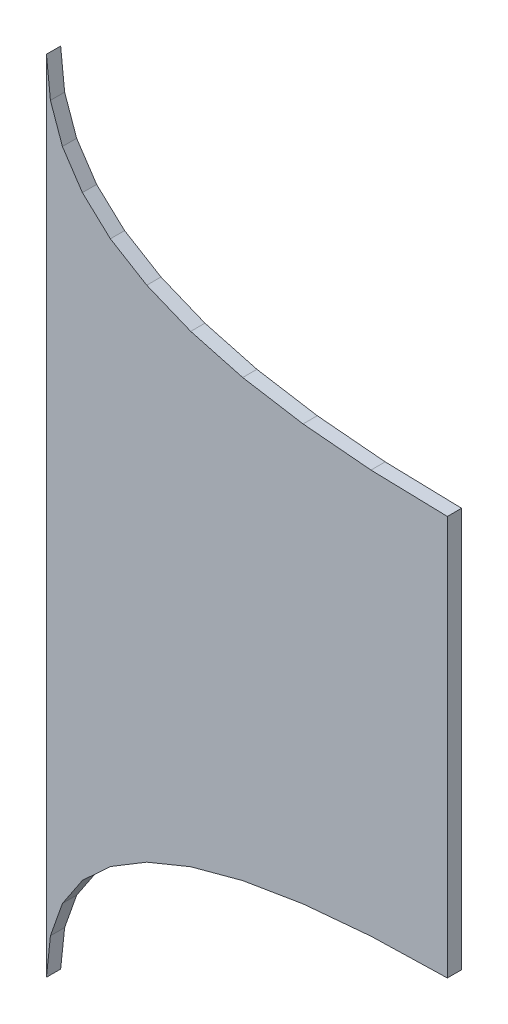
ISO-10303-21;
HEADER;
FILE_DESCRIPTION(('STEP AP214'),'2;1');
FILE_NAME('part.step','',(''),(''),'','','');
FILE_SCHEMA(('AUTOMOTIVE_DESIGN { 1 0 10303 214 1 1 1 1 }'));
ENDSEC;
DATA;
#1=APPLICATION_CONTEXT('core data for automotive mechanical design processes');
#2=APPLICATION_PROTOCOL_DEFINITION('international standard','automotive_design',2000,#1);
#3=PRODUCT_CONTEXT('',#1,'mechanical');
#4=PRODUCT('Part','Part','',(#3));
#5=PRODUCT_RELATED_PRODUCT_CATEGORY('part','',(#4));
#6=PRODUCT_DEFINITION_FORMATION('','',#4);
#7=PRODUCT_DEFINITION_CONTEXT('part definition',#1,'design');
#8=PRODUCT_DEFINITION('design','',#6,#7);
#9=PRODUCT_DEFINITION_SHAPE('','',#8);
#10=(LENGTH_UNIT() NAMED_UNIT(*) SI_UNIT(.MILLI.,.METRE.));
#11=(NAMED_UNIT(*) PLANE_ANGLE_UNIT() SI_UNIT($,.RADIAN.));
#12=(NAMED_UNIT(*) SI_UNIT($,.STERADIAN.) SOLID_ANGLE_UNIT());
#13=UNCERTAINTY_MEASURE_WITH_UNIT(LENGTH_MEASURE(1.E-05),#10,'distance_accuracy_value','');
#14=(GEOMETRIC_REPRESENTATION_CONTEXT(3) GLOBAL_UNCERTAINTY_ASSIGNED_CONTEXT((#13)) GLOBAL_UNIT_ASSIGNED_CONTEXT((#10,
#11,#12)) REPRESENTATION_CONTEXT('',''));
#15=CARTESIAN_POINT('',(0.,0.,0.));
#16=DIRECTION('',(0.,0.,1.));
#17=DIRECTION('',(1.,0.,0.));
#18=AXIS2_PLACEMENT_3D('',#15,#16,#17);
#19=CARTESIAN_POINT('',(80.3170013427734,43.,0.));
#20=DIRECTION('',(-0.0261743727073758,-0.99965739241671,0.));
#21=DIRECTION('',(-0.99965739241671,0.0261743727073758,0.));
#22=AXIS2_PLACEMENT_3D('',#19,#20,#21);
#23=PLANE('',#22);
#24=DIRECTION('',(-0.99965739241671,0.0261743727073758,0.));
#25=VECTOR('',#24,1.);
#26=CARTESIAN_POINT('',(80.3170013427734,43.,0.03556));
#27=LINE('',#26,#25);
#28=CARTESIAN_POINT('',(80.3170013427734,43.,0.03556));
#29=VERTEX_POINT('',#28);
#30=CARTESIAN_POINT('',(80.1259994506836,43.0050010681152,0.03556));
#31=VERTEX_POINT('',#30);
#32=EDGE_CURVE('E11',#29,#31,#27,.T.);
#33=ORIENTED_EDGE('',*,*,#32,.F.);
#34=DIRECTION('',(0.,0.,1.));
#35=VECTOR('',#34,1.);
#36=CARTESIAN_POINT('',(80.3170013427734,43.,0.));
#37=LINE('',#36,#35);
#38=CARTESIAN_POINT('',(80.3170013427734,43.,0.));
#39=VERTEX_POINT('',#38);
#40=EDGE_CURVE('E24',#39,#29,#37,.T.);
#41=ORIENTED_EDGE('',*,*,#40,.F.);
#42=DIRECTION('',(-0.99965739241671,0.0261743727073758,0.));
#43=VECTOR('',#42,1.);
#44=CARTESIAN_POINT('',(80.3170013427734,43.,0.));
#45=LINE('',#44,#43);
#46=CARTESIAN_POINT('',(80.1259994506836,43.0050010681152,0.));
#47=VERTEX_POINT('',#46);
#48=EDGE_CURVE('E184',#39,#47,#45,.T.);
#49=ORIENTED_EDGE('',*,*,#48,.T.);
#50=DIRECTION('',(0.,0.,1.));
#51=VECTOR('',#50,1.);
#52=CARTESIAN_POINT('',(80.1259994506836,43.0050010681152,0.));
#53=LINE('',#52,#51);
#54=EDGE_CURVE('E37',#47,#31,#53,.T.);
#55=ORIENTED_EDGE('',*,*,#54,.T.);
#56=EDGE_LOOP('',(#33,#41,#49,#55));
#57=FACE_BOUND('',#56,.T.);
#58=ADVANCED_FACE('F17',(#57),#23,.F.);
#59=CARTESIAN_POINT('',(80.1259994506836,43.0050010681152,0.));
#60=DIRECTION('',(-0.0878912008707353,-0.996130080265374,0.));
#61=DIRECTION('',(-0.996130080265374,0.0878912008707353,0.));
#62=AXIS2_PLACEMENT_3D('',#59,#60,#61);
#63=PLANE('',#62);
#64=DIRECTION('',(-0.996130080265374,0.0878912008707353,0.));
#65=VECTOR('',#64,1.);
#66=CARTESIAN_POINT('',(80.1259994506836,43.0050010681152,0.03556));
#67=LINE('',#66,#65);
#68=CARTESIAN_POINT('',(79.9560012817383,43.0200004577637,0.03556));
#69=VERTEX_POINT('',#68);
#70=EDGE_CURVE('E336',#31,#69,#67,.T.);
#71=ORIENTED_EDGE('',*,*,#70,.F.);
#72=ORIENTED_EDGE('',*,*,#54,.F.);
#73=DIRECTION('',(-0.996130080265374,0.0878912008707353,0.));
#74=VECTOR('',#73,1.);
#75=CARTESIAN_POINT('',(80.1259994506836,43.0050010681152,0.));
#76=LINE('',#75,#74);
#77=CARTESIAN_POINT('',(79.9560012817383,43.0200004577637,0.));
#78=VERTEX_POINT('',#77);
#79=EDGE_CURVE('E333',#47,#78,#76,.T.);
#80=ORIENTED_EDGE('',*,*,#79,.T.);
#81=DIRECTION('',(0.,0.,1.));
#82=VECTOR('',#81,1.);
#83=CARTESIAN_POINT('',(79.9560012817383,43.0200004577637,0.));
#84=LINE('',#83,#82);
#85=EDGE_CURVE('E331',#78,#69,#84,.T.);
#86=ORIENTED_EDGE('',*,*,#85,.T.);
#87=EDGE_LOOP('',(#71,#72,#80,#86));
#88=FACE_BOUND('',#87,.T.);
#89=ADVANCED_FACE('F344',(#88),#63,.F.);
#90=CARTESIAN_POINT('',(79.9560012817383,43.0200004577637,0.));
#91=DIRECTION('',(-0.163323810363842,-0.986572517845615,0.));
#92=DIRECTION('',(-0.986572517845615,0.163323810363842,0.));
#93=AXIS2_PLACEMENT_3D('',#90,#91,#92);
#94=PLANE('',#93);
#95=DIRECTION('',(-0.986572517845615,0.163323810363842,0.));
#96=VECTOR('',#95,1.);
#97=CARTESIAN_POINT('',(79.9560012817383,43.0200004577637,0.03556));
#98=LINE('',#97,#96);
#99=CARTESIAN_POINT('',(79.8050003051758,43.0449981689453,0.03556));
#100=VERTEX_POINT('',#99);
#101=EDGE_CURVE('E328',#69,#100,#98,.T.);
#102=ORIENTED_EDGE('',*,*,#101,.F.);
#103=ORIENTED_EDGE('',*,*,#85,.F.);
#104=DIRECTION('',(-0.986572517845615,0.163323810363842,0.));
#105=VECTOR('',#104,1.);
#106=CARTESIAN_POINT('',(79.9560012817383,43.0200004577637,0.));
#107=LINE('',#106,#105);
#108=CARTESIAN_POINT('',(79.8050003051758,43.0449981689453,0.));
#109=VERTEX_POINT('',#108);
#110=EDGE_CURVE('E325',#78,#109,#107,.T.);
#111=ORIENTED_EDGE('',*,*,#110,.T.);
#112=DIRECTION('',(0.,0.,1.));
#113=VECTOR('',#112,1.);
#114=CARTESIAN_POINT('',(79.8050003051758,43.0449981689453,0.));
#115=LINE('',#114,#113);
#116=EDGE_CURVE('E323',#109,#100,#115,.T.);
#117=ORIENTED_EDGE('',*,*,#116,.T.);
#118=EDGE_LOOP('',(#102,#103,#111,#117));
#119=FACE_BOUND('',#118,.T.);
#120=ADVANCED_FACE('F350',(#119),#94,.F.);
#121=CARTESIAN_POINT('',(79.8050003051758,43.0449981689453,0.));
#122=DIRECTION('',(-0.260003958104314,-0.965607550597079,0.));
#123=DIRECTION('',(-0.965607550597079,0.260003958104314,0.));
#124=AXIS2_PLACEMENT_3D('',#121,#122,#123);
#125=PLANE('',#124);
#126=DIRECTION('',(-0.965607550597079,0.260003958104313,0.));
#127=VECTOR('',#126,1.);
#128=CARTESIAN_POINT('',(79.8050003051758,43.0449981689453,0.03556));
#129=LINE('',#128,#127);
#130=CARTESIAN_POINT('',(79.6750030517578,43.0800018310547,0.03556));
#131=VERTEX_POINT('',#130);
#132=EDGE_CURVE('E320',#100,#131,#129,.T.);
#133=ORIENTED_EDGE('',*,*,#132,.F.);
#134=ORIENTED_EDGE('',*,*,#116,.F.);
#135=DIRECTION('',(-0.965607550597079,0.260003958104313,0.));
#136=VECTOR('',#135,1.);
#137=CARTESIAN_POINT('',(79.8050003051758,43.0449981689453,0.));
#138=LINE('',#137,#136);
#139=CARTESIAN_POINT('',(79.6750030517578,43.0800018310547,0.));
#140=VERTEX_POINT('',#139);
#141=EDGE_CURVE('E317',#109,#140,#138,.T.);
#142=ORIENTED_EDGE('',*,*,#141,.T.);
#143=DIRECTION('',(0.,0.,1.));
#144=VECTOR('',#143,1.);
#145=CARTESIAN_POINT('',(79.6750030517578,43.0800018310547,0.));
#146=LINE('',#145,#144);
#147=EDGE_CURVE('E315',#140,#131,#146,.T.);
#148=ORIENTED_EDGE('',*,*,#147,.T.);
#149=EDGE_LOOP('',(#133,#134,#142,#148));
#150=FACE_BOUND('',#149,.T.);
#151=ADVANCED_FACE('F352',(#150),#125,.F.);
#152=CARTESIAN_POINT('',(79.6750030517578,43.0800018310547,0.));
#153=DIRECTION('',(-0.378617848069705,-0.92555309146643,0.));
#154=DIRECTION('',(-0.92555309146643,0.378617848069705,0.));
#155=AXIS2_PLACEMENT_3D('',#152,#153,#154);
#156=PLANE('',#155);
#157=DIRECTION('',(-0.92555309146643,0.378617848069705,0.));
#158=VECTOR('',#157,1.);
#159=CARTESIAN_POINT('',(79.6750030517578,43.0800018310547,0.03556));
#160=LINE('',#159,#158);
#161=CARTESIAN_POINT('',(79.5650024414062,43.125,0.03556));
#162=VERTEX_POINT('',#161);
#163=EDGE_CURVE('E312',#131,#162,#160,.T.);
#164=ORIENTED_EDGE('',*,*,#163,.F.);
#165=ORIENTED_EDGE('',*,*,#147,.F.);
#166=DIRECTION('',(-0.92555309146643,0.378617848069705,0.));
#167=VECTOR('',#166,1.);
#168=CARTESIAN_POINT('',(79.6750030517578,43.0800018310547,0.));
#169=LINE('',#168,#167);
#170=CARTESIAN_POINT('',(79.5650024414062,43.125,0.));
#171=VERTEX_POINT('',#170);
#172=EDGE_CURVE('E309',#140,#171,#169,.T.);
#173=ORIENTED_EDGE('',*,*,#172,.T.);
#174=DIRECTION('',(0.,0.,1.));
#175=VECTOR('',#174,1.);
#176=CARTESIAN_POINT('',(79.5650024414062,43.125,0.));
#177=LINE('',#176,#175);
#178=EDGE_CURVE('E307',#171,#162,#177,.T.);
#179=ORIENTED_EDGE('',*,*,#178,.T.);
#180=EDGE_LOOP('',(#164,#165,#173,#179));
#181=FACE_BOUND('',#180,.T.);
#182=ADVANCED_FACE('F357',(#181),#156,.F.);
#183=CARTESIAN_POINT('',(79.5650024414062,43.125,0.));
#184=DIRECTION('',(-0.517247042744461,-0.85583613897294,0.));
#185=DIRECTION('',(-0.85583613897294,0.517247042744461,0.));
#186=AXIS2_PLACEMENT_3D('',#183,#184,#185);
#187=PLANE('',#186);
#188=DIRECTION('',(-0.85583613897294,0.517247042744461,0.));
#189=VECTOR('',#188,1.);
#190=CARTESIAN_POINT('',(79.5650024414062,43.125,0.03556));
#191=LINE('',#190,#189);
#192=CARTESIAN_POINT('',(79.4739990234375,43.1800003051758,0.03556));
#193=VERTEX_POINT('',#192);
#194=EDGE_CURVE('E304',#162,#193,#191,.T.);
#195=ORIENTED_EDGE('',*,*,#194,.F.);
#196=ORIENTED_EDGE('',*,*,#178,.F.);
#197=DIRECTION('',(-0.85583613897294,0.517247042744461,0.));
#198=VECTOR('',#197,1.);
#199=CARTESIAN_POINT('',(79.5650024414062,43.125,0.));
#200=LINE('',#199,#198);
#201=CARTESIAN_POINT('',(79.4739990234375,43.1800003051758,0.));
#202=VERTEX_POINT('',#201);
#203=EDGE_CURVE('E301',#171,#202,#200,.T.);
#204=ORIENTED_EDGE('',*,*,#203,.T.);
#205=DIRECTION('',(0.,0.,1.));
#206=VECTOR('',#205,1.);
#207=CARTESIAN_POINT('',(79.4739990234375,43.1800003051758,0.));
#208=LINE('',#207,#206);
#209=EDGE_CURVE('E299',#202,#193,#208,.T.);
#210=ORIENTED_EDGE('',*,*,#209,.T.);
#211=EDGE_LOOP('',(#195,#196,#204,#210));
#212=FACE_BOUND('',#211,.T.);
#213=ADVANCED_FACE('F360',(#212),#187,.F.);
#214=CARTESIAN_POINT('',(79.4739990234375,43.1800003051758,0.));
#215=DIRECTION('',(-0.680444972397261,-0.732799180907901,0.));
#216=DIRECTION('',(-0.732799180907901,0.680444972397261,0.));
#217=AXIS2_PLACEMENT_3D('',#214,#215,#216);
#218=PLANE('',#217);
#219=DIRECTION('',(-0.732799180907901,0.680444972397261,0.));
#220=VECTOR('',#219,1.);
#221=CARTESIAN_POINT('',(79.4739990234375,43.1800003051758,0.03556));
#222=LINE('',#221,#220);
#223=CARTESIAN_POINT('',(79.4039993286133,43.2449989318848,0.03556));
#224=VERTEX_POINT('',#223);
#225=EDGE_CURVE('E296',#193,#224,#222,.T.);
#226=ORIENTED_EDGE('',*,*,#225,.F.);
#227=ORIENTED_EDGE('',*,*,#209,.F.);
#228=DIRECTION('',(-0.732799180907901,0.680444972397261,0.));
#229=VECTOR('',#228,1.);
#230=CARTESIAN_POINT('',(79.4739990234375,43.1800003051758,0.));
#231=LINE('',#230,#229);
#232=CARTESIAN_POINT('',(79.4039993286133,43.2449989318848,0.));
#233=VERTEX_POINT('',#232);
#234=EDGE_CURVE('E293',#202,#233,#231,.T.);
#235=ORIENTED_EDGE('',*,*,#234,.T.);
#236=DIRECTION('',(0.,0.,1.));
#237=VECTOR('',#236,1.);
#238=CARTESIAN_POINT('',(79.4039993286133,43.2449989318848,0.));
#239=LINE('',#238,#237);
#240=EDGE_CURVE('E291',#233,#224,#239,.T.);
#241=ORIENTED_EDGE('',*,*,#240,.T.);
#242=EDGE_LOOP('',(#226,#227,#235,#241));
#243=FACE_BOUND('',#242,.T.);
#244=ADVANCED_FACE('F365',(#243),#218,.F.);
#245=CARTESIAN_POINT('',(79.4039993286133,43.2449989318848,0.));
#246=DIRECTION('',(-0.832037272824398,-0.554719727998688,0.));
#247=DIRECTION('',(-0.554719727998688,0.832037272824398,0.));
#248=AXIS2_PLACEMENT_3D('',#245,#246,#247);
#249=PLANE('',#248);
#250=DIRECTION('',(-0.554719727998688,0.832037272824398,0.));
#251=VECTOR('',#250,1.);
#252=CARTESIAN_POINT('',(79.4039993286133,43.2449989318848,0.03556));
#253=LINE('',#252,#251);
#254=CARTESIAN_POINT('',(79.3539962768555,43.3199996948242,0.03556));
#255=VERTEX_POINT('',#254);
#256=EDGE_CURVE('E288',#224,#255,#253,.T.);
#257=ORIENTED_EDGE('',*,*,#256,.F.);
#258=ORIENTED_EDGE('',*,*,#240,.F.);
#259=DIRECTION('',(-0.554719727998688,0.832037272824398,0.));
#260=VECTOR('',#259,1.);
#261=CARTESIAN_POINT('',(79.4039993286133,43.2449989318848,0.));
#262=LINE('',#261,#260);
#263=CARTESIAN_POINT('',(79.3539962768555,43.3199996948242,0.));
#264=VERTEX_POINT('',#263);
#265=EDGE_CURVE('E285',#233,#264,#262,.T.);
#266=ORIENTED_EDGE('',*,*,#265,.T.);
#267=DIRECTION('',(0.,0.,1.));
#268=VECTOR('',#267,1.);
#269=CARTESIAN_POINT('',(79.3539962768555,43.3199996948242,0.));
#270=LINE('',#269,#268);
#271=EDGE_CURVE('E283',#264,#255,#270,.T.);
#272=ORIENTED_EDGE('',*,*,#271,.T.);
#273=EDGE_LOOP('',(#257,#258,#266,#272));
#274=FACE_BOUND('',#273,.T.);
#275=ADVANCED_FACE('F368',(#274),#249,.F.);
#276=CARTESIAN_POINT('',(79.3539962768555,43.3199996948242,0.));
#277=DIRECTION('',(-0.94299345877424,-0.332811262893844,0.));
#278=DIRECTION('',(-0.332811262893844,0.94299345877424,0.));
#279=AXIS2_PLACEMENT_3D('',#276,#277,#278);
#280=PLANE('',#279);
#281=DIRECTION('',(-0.332811262893844,0.94299345877424,0.));
#282=VECTOR('',#281,1.);
#283=CARTESIAN_POINT('',(79.3539962768555,43.3199996948242,0.03556));
#284=LINE('',#283,#282);
#285=CARTESIAN_POINT('',(79.3239974975586,43.4049987792969,0.03556));
#286=VERTEX_POINT('',#285);
#287=EDGE_CURVE('E280',#255,#286,#284,.T.);
#288=ORIENTED_EDGE('',*,*,#287,.F.);
#289=ORIENTED_EDGE('',*,*,#271,.F.);
#290=DIRECTION('',(-0.332811262893844,0.94299345877424,0.));
#291=VECTOR('',#290,1.);
#292=CARTESIAN_POINT('',(79.3539962768555,43.3199996948242,0.));
#293=LINE('',#292,#291);
#294=CARTESIAN_POINT('',(79.3239974975586,43.4049987792969,0.));
#295=VERTEX_POINT('',#294);
#296=EDGE_CURVE('E277',#264,#295,#293,.T.);
#297=ORIENTED_EDGE('',*,*,#296,.T.);
#298=DIRECTION('',(0.,0.,1.));
#299=VECTOR('',#298,1.);
#300=CARTESIAN_POINT('',(79.3239974975586,43.4049987792969,0.));
#301=LINE('',#300,#299);
#302=EDGE_CURVE('E275',#295,#286,#301,.T.);
#303=ORIENTED_EDGE('',*,*,#302,.T.);
#304=EDGE_LOOP('',(#288,#289,#297,#303));
#305=FACE_BOUND('',#304,.T.);
#306=ADVANCED_FACE('F373',(#305),#280,.F.);
#307=CARTESIAN_POINT('',(79.3239974975586,43.4049987792969,0.));
#308=DIRECTION('',(-0.994511578049105,-0.104626579444613,0.));
#309=DIRECTION('',(-0.104626579444613,0.994511578049105,0.));
#310=AXIS2_PLACEMENT_3D('',#307,#308,#309);
#311=PLANE('',#310);
#312=DIRECTION('',(-0.104626579444613,0.994511578049105,0.));
#313=VECTOR('',#312,1.);
#314=CARTESIAN_POINT('',(79.3239974975586,43.4049987792969,0.03556));
#315=LINE('',#314,#313);
#316=CARTESIAN_POINT('',(79.3140029907227,43.5,0.03556));
#317=VERTEX_POINT('',#316);
#318=EDGE_CURVE('E272',#286,#317,#315,.T.);
#319=ORIENTED_EDGE('',*,*,#318,.F.);
#320=ORIENTED_EDGE('',*,*,#302,.F.);
#321=DIRECTION('',(-0.104626579444613,0.994511578049105,0.));
#322=VECTOR('',#321,1.);
#323=CARTESIAN_POINT('',(79.3239974975586,43.4049987792969,0.));
#324=LINE('',#323,#322);
#325=CARTESIAN_POINT('',(79.3140029907227,43.5,0.));
#326=VERTEX_POINT('',#325);
#327=EDGE_CURVE('E269',#295,#326,#324,.T.);
#328=ORIENTED_EDGE('',*,*,#327,.T.);
#329=DIRECTION('',(0.,0.,1.));
#330=VECTOR('',#329,1.);
#331=CARTESIAN_POINT('',(79.3140029907227,43.5,0.));
#332=LINE('',#331,#330);
#333=EDGE_CURVE('E267',#326,#317,#332,.T.);
#334=ORIENTED_EDGE('',*,*,#333,.T.);
#335=EDGE_LOOP('',(#319,#320,#328,#334));
#336=FACE_BOUND('',#335,.T.);
#337=ADVANCED_FACE('F376',(#336),#311,.F.);
#338=CARTESIAN_POINT('',(79.3140029907227,43.5,0.));
#339=DIRECTION('',(1.,0.,0.));
#340=DIRECTION('',(0.,-1.,0.));
#341=AXIS2_PLACEMENT_3D('',#338,#339,#340);
#342=PLANE('',#341);
#343=DIRECTION('',(0.,-1.,0.));
#344=VECTOR('',#343,1.);
#345=CARTESIAN_POINT('',(79.3140029907227,43.5,0.03556));
#346=LINE('',#345,#344);
#347=CARTESIAN_POINT('',(79.3140029907227,41.5,0.03556));
#348=VERTEX_POINT('',#347);
#349=EDGE_CURVE('E264',#317,#348,#346,.T.);
#350=ORIENTED_EDGE('',*,*,#349,.F.);
#351=ORIENTED_EDGE('',*,*,#333,.F.);
#352=DIRECTION('',(0.,-1.,0.));
#353=VECTOR('',#352,1.);
#354=CARTESIAN_POINT('',(79.3140029907227,43.5,0.));
#355=LINE('',#354,#353);
#356=CARTESIAN_POINT('',(79.3140029907227,41.5,0.));
#357=VERTEX_POINT('',#356);
#358=EDGE_CURVE('E261',#326,#357,#355,.T.);
#359=ORIENTED_EDGE('',*,*,#358,.T.);
#360=DIRECTION('',(0.,0.,1.));
#361=VECTOR('',#360,1.);
#362=CARTESIAN_POINT('',(79.3140029907227,41.5,0.));
#363=LINE('',#362,#361);
#364=EDGE_CURVE('E259',#357,#348,#363,.T.);
#365=ORIENTED_EDGE('',*,*,#364,.T.);
#366=EDGE_LOOP('',(#350,#351,#359,#365));
#367=FACE_BOUND('',#366,.T.);
#368=ADVANCED_FACE('F381',(#367),#342,.F.);
#369=CARTESIAN_POINT('',(79.3140029907227,41.5,0.));
#370=DIRECTION('',(-0.994511578049105,0.104626579444613,0.));
#371=DIRECTION('',(0.104626579444613,0.994511578049105,0.));
#372=AXIS2_PLACEMENT_3D('',#369,#370,#371);
#373=PLANE('',#372);
#374=DIRECTION('',(0.104626579444613,0.994511578049105,0.));
#375=VECTOR('',#374,1.);
#376=CARTESIAN_POINT('',(79.3140029907227,41.5,0.03556));
#377=LINE('',#376,#375);
#378=CARTESIAN_POINT('',(79.3239974975586,41.5950012207031,0.03556));
#379=VERTEX_POINT('',#378);
#380=EDGE_CURVE('E256',#348,#379,#377,.T.);
#381=ORIENTED_EDGE('',*,*,#380,.F.);
#382=ORIENTED_EDGE('',*,*,#364,.F.);
#383=DIRECTION('',(0.104626579444613,0.994511578049105,0.));
#384=VECTOR('',#383,1.);
#385=CARTESIAN_POINT('',(79.3140029907227,41.5,0.));
#386=LINE('',#385,#384);
#387=CARTESIAN_POINT('',(79.3239974975586,41.5950012207031,0.));
#388=VERTEX_POINT('',#387);
#389=EDGE_CURVE('E253',#357,#388,#386,.T.);
#390=ORIENTED_EDGE('',*,*,#389,.T.);
#391=DIRECTION('',(0.,0.,1.));
#392=VECTOR('',#391,1.);
#393=CARTESIAN_POINT('',(79.3239974975586,41.5950012207031,0.));
#394=LINE('',#393,#392);
#395=EDGE_CURVE('E251',#388,#379,#394,.T.);
#396=ORIENTED_EDGE('',*,*,#395,.T.);
#397=EDGE_LOOP('',(#381,#382,#390,#396));
#398=FACE_BOUND('',#397,.T.);
#399=ADVANCED_FACE('F384',(#398),#373,.F.);
#400=CARTESIAN_POINT('',(79.3239974975586,41.5950012207031,0.));
#401=DIRECTION('',(-0.94299345877424,0.332811262893844,0.));
#402=DIRECTION('',(0.332811262893844,0.94299345877424,0.));
#403=AXIS2_PLACEMENT_3D('',#400,#401,#402);
#404=PLANE('',#403);
#405=DIRECTION('',(0.332811262893844,0.94299345877424,0.));
#406=VECTOR('',#405,1.);
#407=CARTESIAN_POINT('',(79.3239974975586,41.5950012207031,0.03556));
#408=LINE('',#407,#406);
#409=CARTESIAN_POINT('',(79.3539962768555,41.6800003051758,0.03556));
#410=VERTEX_POINT('',#409);
#411=EDGE_CURVE('E248',#379,#410,#408,.T.);
#412=ORIENTED_EDGE('',*,*,#411,.F.);
#413=ORIENTED_EDGE('',*,*,#395,.F.);
#414=DIRECTION('',(0.332811262893844,0.94299345877424,0.));
#415=VECTOR('',#414,1.);
#416=CARTESIAN_POINT('',(79.3239974975586,41.5950012207031,0.));
#417=LINE('',#416,#415);
#418=CARTESIAN_POINT('',(79.3539962768555,41.6800003051758,0.));
#419=VERTEX_POINT('',#418);
#420=EDGE_CURVE('E245',#388,#419,#417,.T.);
#421=ORIENTED_EDGE('',*,*,#420,.T.);
#422=DIRECTION('',(0.,0.,1.));
#423=VECTOR('',#422,1.);
#424=CARTESIAN_POINT('',(79.3539962768555,41.6800003051758,0.));
#425=LINE('',#424,#423);
#426=EDGE_CURVE('E243',#419,#410,#425,.T.);
#427=ORIENTED_EDGE('',*,*,#426,.T.);
#428=EDGE_LOOP('',(#412,#413,#421,#427));
#429=FACE_BOUND('',#428,.T.);
#430=ADVANCED_FACE('F389',(#429),#404,.F.);
#431=CARTESIAN_POINT('',(79.3539962768555,41.6800003051758,0.));
#432=DIRECTION('',(-0.832037272824398,0.554719727998688,0.));
#433=DIRECTION('',(0.554719727998688,0.832037272824398,0.));
#434=AXIS2_PLACEMENT_3D('',#431,#432,#433);
#435=PLANE('',#434);
#436=DIRECTION('',(0.554719727998688,0.832037272824398,0.));
#437=VECTOR('',#436,1.);
#438=CARTESIAN_POINT('',(79.3539962768555,41.6800003051758,0.03556));
#439=LINE('',#438,#437);
#440=CARTESIAN_POINT('',(79.4039993286133,41.7550010681152,0.03556));
#441=VERTEX_POINT('',#440);
#442=EDGE_CURVE('E240',#410,#441,#439,.T.);
#443=ORIENTED_EDGE('',*,*,#442,.F.);
#444=ORIENTED_EDGE('',*,*,#426,.F.);
#445=DIRECTION('',(0.554719727998688,0.832037272824398,0.));
#446=VECTOR('',#445,1.);
#447=CARTESIAN_POINT('',(79.3539962768555,41.6800003051758,0.));
#448=LINE('',#447,#446);
#449=CARTESIAN_POINT('',(79.4039993286133,41.7550010681152,0.));
#450=VERTEX_POINT('',#449);
#451=EDGE_CURVE('E237',#419,#450,#448,.T.);
#452=ORIENTED_EDGE('',*,*,#451,.T.);
#453=DIRECTION('',(0.,0.,1.));
#454=VECTOR('',#453,1.);
#455=CARTESIAN_POINT('',(79.4039993286133,41.7550010681152,0.));
#456=LINE('',#455,#454);
#457=EDGE_CURVE('E235',#450,#441,#456,.T.);
#458=ORIENTED_EDGE('',*,*,#457,.T.);
#459=EDGE_LOOP('',(#443,#444,#452,#458));
#460=FACE_BOUND('',#459,.T.);
#461=ADVANCED_FACE('F392',(#460),#435,.F.);
#462=CARTESIAN_POINT('',(79.4039993286133,41.7550010681152,0.));
#463=DIRECTION('',(-0.680444972397261,0.732799180907901,0.));
#464=DIRECTION('',(0.732799180907901,0.680444972397261,0.));
#465=AXIS2_PLACEMENT_3D('',#462,#463,#464);
#466=PLANE('',#465);
#467=DIRECTION('',(0.732799180907901,0.680444972397261,0.));
#468=VECTOR('',#467,1.);
#469=CARTESIAN_POINT('',(79.4039993286133,41.7550010681152,0.03556));
#470=LINE('',#469,#468);
#471=CARTESIAN_POINT('',(79.4739990234375,41.8199996948242,0.03556));
#472=VERTEX_POINT('',#471);
#473=EDGE_CURVE('E232',#441,#472,#470,.T.);
#474=ORIENTED_EDGE('',*,*,#473,.F.);
#475=ORIENTED_EDGE('',*,*,#457,.F.);
#476=DIRECTION('',(0.732799180907901,0.680444972397261,0.));
#477=VECTOR('',#476,1.);
#478=CARTESIAN_POINT('',(79.4039993286133,41.7550010681152,0.));
#479=LINE('',#478,#477);
#480=CARTESIAN_POINT('',(79.4739990234375,41.8199996948242,0.));
#481=VERTEX_POINT('',#480);
#482=EDGE_CURVE('E229',#450,#481,#479,.T.);
#483=ORIENTED_EDGE('',*,*,#482,.T.);
#484=DIRECTION('',(0.,0.,1.));
#485=VECTOR('',#484,1.);
#486=CARTESIAN_POINT('',(79.4739990234375,41.8199996948242,0.));
#487=LINE('',#486,#485);
#488=EDGE_CURVE('E227',#481,#472,#487,.T.);
#489=ORIENTED_EDGE('',*,*,#488,.T.);
#490=EDGE_LOOP('',(#474,#475,#483,#489));
#491=FACE_BOUND('',#490,.T.);
#492=ADVANCED_FACE('F397',(#491),#466,.F.);
#493=CARTESIAN_POINT('',(79.4739990234375,41.8199996948242,0.));
#494=DIRECTION('',(-0.517247042744461,0.85583613897294,0.));
#495=DIRECTION('',(0.85583613897294,0.517247042744461,0.));
#496=AXIS2_PLACEMENT_3D('',#493,#494,#495);
#497=PLANE('',#496);
#498=DIRECTION('',(0.85583613897294,0.517247042744461,0.));
#499=VECTOR('',#498,1.);
#500=CARTESIAN_POINT('',(79.4739990234375,41.8199996948242,0.03556));
#501=LINE('',#500,#499);
#502=CARTESIAN_POINT('',(79.5650024414062,41.875,0.03556));
#503=VERTEX_POINT('',#502);
#504=EDGE_CURVE('E224',#472,#503,#501,.T.);
#505=ORIENTED_EDGE('',*,*,#504,.F.);
#506=ORIENTED_EDGE('',*,*,#488,.F.);
#507=DIRECTION('',(0.85583613897294,0.517247042744461,0.));
#508=VECTOR('',#507,1.);
#509=CARTESIAN_POINT('',(79.4739990234375,41.8199996948242,0.));
#510=LINE('',#509,#508);
#511=CARTESIAN_POINT('',(79.5650024414062,41.875,0.));
#512=VERTEX_POINT('',#511);
#513=EDGE_CURVE('E221',#481,#512,#510,.T.);
#514=ORIENTED_EDGE('',*,*,#513,.T.);
#515=DIRECTION('',(0.,0.,1.));
#516=VECTOR('',#515,1.);
#517=CARTESIAN_POINT('',(79.5650024414062,41.875,0.));
#518=LINE('',#517,#516);
#519=EDGE_CURVE('E219',#512,#503,#518,.T.);
#520=ORIENTED_EDGE('',*,*,#519,.T.);
#521=EDGE_LOOP('',(#505,#506,#514,#520));
#522=FACE_BOUND('',#521,.T.);
#523=ADVANCED_FACE('F400',(#522),#497,.F.);
#524=CARTESIAN_POINT('',(79.5650024414062,41.875,0.));
#525=DIRECTION('',(-0.378617848069705,0.92555309146643,0.));
#526=DIRECTION('',(0.92555309146643,0.378617848069705,0.));
#527=AXIS2_PLACEMENT_3D('',#524,#525,#526);
#528=PLANE('',#527);
#529=DIRECTION('',(0.92555309146643,0.378617848069705,0.));
#530=VECTOR('',#529,1.);
#531=CARTESIAN_POINT('',(79.5650024414062,41.875,0.03556));
#532=LINE('',#531,#530);
#533=CARTESIAN_POINT('',(79.6750030517578,41.9199981689453,0.03556));
#534=VERTEX_POINT('',#533);
#535=EDGE_CURVE('E216',#503,#534,#532,.T.);
#536=ORIENTED_EDGE('',*,*,#535,.F.);
#537=ORIENTED_EDGE('',*,*,#519,.F.);
#538=DIRECTION('',(0.92555309146643,0.378617848069705,0.));
#539=VECTOR('',#538,1.);
#540=CARTESIAN_POINT('',(79.5650024414062,41.875,0.));
#541=LINE('',#540,#539);
#542=CARTESIAN_POINT('',(79.6750030517578,41.9199981689453,0.));
#543=VERTEX_POINT('',#542);
#544=EDGE_CURVE('E213',#512,#543,#541,.T.);
#545=ORIENTED_EDGE('',*,*,#544,.T.);
#546=DIRECTION('',(0.,0.,1.));
#547=VECTOR('',#546,1.);
#548=CARTESIAN_POINT('',(79.6750030517578,41.9199981689453,0.));
#549=LINE('',#548,#547);
#550=EDGE_CURVE('E211',#543,#534,#549,.T.);
#551=ORIENTED_EDGE('',*,*,#550,.T.);
#552=EDGE_LOOP('',(#536,#537,#545,#551));
#553=FACE_BOUND('',#552,.T.);
#554=ADVANCED_FACE('F405',(#553),#528,.F.);
#555=CARTESIAN_POINT('',(79.6750030517578,41.9199981689453,0.));
#556=DIRECTION('',(-0.260003958104314,0.965607550597079,0.));
#557=DIRECTION('',(0.965607550597079,0.260003958104314,0.));
#558=AXIS2_PLACEMENT_3D('',#555,#556,#557);
#559=PLANE('',#558);
#560=DIRECTION('',(0.965607550597079,0.260003958104313,0.));
#561=VECTOR('',#560,1.);
#562=CARTESIAN_POINT('',(79.6750030517578,41.9199981689453,0.03556));
#563=LINE('',#562,#561);
#564=CARTESIAN_POINT('',(79.8050003051758,41.9550018310547,0.03556));
#565=VERTEX_POINT('',#564);
#566=EDGE_CURVE('E208',#534,#565,#563,.T.);
#567=ORIENTED_EDGE('',*,*,#566,.F.);
#568=ORIENTED_EDGE('',*,*,#550,.F.);
#569=DIRECTION('',(0.965607550597079,0.260003958104313,0.));
#570=VECTOR('',#569,1.);
#571=CARTESIAN_POINT('',(79.6750030517578,41.9199981689453,0.));
#572=LINE('',#571,#570);
#573=CARTESIAN_POINT('',(79.8050003051758,41.9550018310547,0.));
#574=VERTEX_POINT('',#573);
#575=EDGE_CURVE('E205',#543,#574,#572,.T.);
#576=ORIENTED_EDGE('',*,*,#575,.T.);
#577=DIRECTION('',(0.,0.,1.));
#578=VECTOR('',#577,1.);
#579=CARTESIAN_POINT('',(79.8050003051758,41.9550018310547,0.));
#580=LINE('',#579,#578);
#581=EDGE_CURVE('E203',#574,#565,#580,.T.);
#582=ORIENTED_EDGE('',*,*,#581,.T.);
#583=EDGE_LOOP('',(#567,#568,#576,#582));
#584=FACE_BOUND('',#583,.T.);
#585=ADVANCED_FACE('F408',(#584),#559,.F.);
#586=CARTESIAN_POINT('',(79.8050003051758,41.9550018310547,0.));
#587=DIRECTION('',(-0.163323810363842,0.986572517845615,0.));
#588=DIRECTION('',(0.986572517845615,0.163323810363842,0.));
#589=AXIS2_PLACEMENT_3D('',#586,#587,#588);
#590=PLANE('',#589);
#591=DIRECTION('',(0.986572517845615,0.163323810363842,0.));
#592=VECTOR('',#591,1.);
#593=CARTESIAN_POINT('',(79.8050003051758,41.9550018310547,0.03556));
#594=LINE('',#593,#592);
#595=CARTESIAN_POINT('',(79.9560012817383,41.9799995422363,0.03556));
#596=VERTEX_POINT('',#595);
#597=EDGE_CURVE('E200',#565,#596,#594,.T.);
#598=ORIENTED_EDGE('',*,*,#597,.F.);
#599=ORIENTED_EDGE('',*,*,#581,.F.);
#600=DIRECTION('',(0.986572517845615,0.163323810363842,0.));
#601=VECTOR('',#600,1.);
#602=CARTESIAN_POINT('',(79.8050003051758,41.9550018310547,0.));
#603=LINE('',#602,#601);
#604=CARTESIAN_POINT('',(79.9560012817383,41.9799995422363,0.));
#605=VERTEX_POINT('',#604);
#606=EDGE_CURVE('E197',#574,#605,#603,.T.);
#607=ORIENTED_EDGE('',*,*,#606,.T.);
#608=DIRECTION('',(0.,0.,1.));
#609=VECTOR('',#608,1.);
#610=CARTESIAN_POINT('',(79.9560012817383,41.9799995422363,0.));
#611=LINE('',#610,#609);
#612=EDGE_CURVE('E195',#605,#596,#611,.T.);
#613=ORIENTED_EDGE('',*,*,#612,.T.);
#614=EDGE_LOOP('',(#598,#599,#607,#613));
#615=FACE_BOUND('',#614,.T.);
#616=ADVANCED_FACE('F413',(#615),#590,.F.);
#617=CARTESIAN_POINT('',(79.9560012817383,41.9799995422363,0.));
#618=DIRECTION('',(-0.0878912008707353,0.996130080265374,0.));
#619=DIRECTION('',(0.996130080265374,0.0878912008707353,0.));
#620=AXIS2_PLACEMENT_3D('',#617,#618,#619);
#621=PLANE('',#620);
#622=DIRECTION('',(0.996130080265374,0.0878912008707353,0.));
#623=VECTOR('',#622,1.);
#624=CARTESIAN_POINT('',(79.9560012817383,41.9799995422363,0.03556));
#625=LINE('',#624,#623);
#626=CARTESIAN_POINT('',(80.1259994506836,41.9949989318848,0.03556));
#627=VERTEX_POINT('',#626);
#628=EDGE_CURVE('E192',#596,#627,#625,.T.);
#629=ORIENTED_EDGE('',*,*,#628,.F.);
#630=ORIENTED_EDGE('',*,*,#612,.F.);
#631=DIRECTION('',(0.996130080265374,0.0878912008707353,0.));
#632=VECTOR('',#631,1.);
#633=CARTESIAN_POINT('',(79.9560012817383,41.9799995422363,0.));
#634=LINE('',#633,#632);
#635=CARTESIAN_POINT('',(80.1259994506836,41.9949989318848,0.));
#636=VERTEX_POINT('',#635);
#637=EDGE_CURVE('E190',#605,#636,#634,.T.);
#638=ORIENTED_EDGE('',*,*,#637,.T.);
#639=DIRECTION('',(0.,0.,1.));
#640=VECTOR('',#639,1.);
#641=CARTESIAN_POINT('',(80.1259994506836,41.9949989318848,0.));
#642=LINE('',#641,#640);
#643=EDGE_CURVE('E175',#636,#627,#642,.T.);
#644=ORIENTED_EDGE('',*,*,#643,.T.);
#645=EDGE_LOOP('',(#629,#630,#638,#644));
#646=FACE_BOUND('',#645,.T.);
#647=ADVANCED_FACE('F415',(#646),#621,.F.);
#648=CARTESIAN_POINT('',(80.1259994506836,41.9949989318848,0.));
#649=DIRECTION('',(-0.0261743727073758,0.99965739241671,0.));
#650=DIRECTION('',(0.99965739241671,0.0261743727073758,0.));
#651=AXIS2_PLACEMENT_3D('',#648,#649,#650);
#652=PLANE('',#651);
#653=DIRECTION('',(0.99965739241671,0.0261743727073758,0.));
#654=VECTOR('',#653,1.);
#655=CARTESIAN_POINT('',(80.1259994506836,41.9949989318848,0.03556));
#656=LINE('',#655,#654);
#657=CARTESIAN_POINT('',(80.3170013427734,42.,0.03556));
#658=VERTEX_POINT('',#657);
#659=EDGE_CURVE('E179',#627,#658,#656,.T.);
#660=ORIENTED_EDGE('',*,*,#659,.F.);
#661=ORIENTED_EDGE('',*,*,#643,.F.);
#662=DIRECTION('',(0.99965739241671,0.0261743727073758,0.));
#663=VECTOR('',#662,1.);
#664=CARTESIAN_POINT('',(80.1259994506836,41.9949989318848,0.));
#665=LINE('',#664,#663);
#666=CARTESIAN_POINT('',(80.3170013427734,42.,0.));
#667=VERTEX_POINT('',#666);
#668=EDGE_CURVE('E171',#636,#667,#665,.T.);
#669=ORIENTED_EDGE('',*,*,#668,.T.);
#670=DIRECTION('',(0.,0.,1.));
#671=VECTOR('',#670,1.);
#672=CARTESIAN_POINT('',(80.3170013427734,42.,0.));
#673=LINE('',#672,#671);
#674=EDGE_CURVE('E161',#667,#658,#673,.T.);
#675=ORIENTED_EDGE('',*,*,#674,.T.);
#676=EDGE_LOOP('',(#660,#661,#669,#675));
#677=FACE_BOUND('',#676,.T.);
#678=ADVANCED_FACE('F174',(#677),#652,.F.);
#679=CARTESIAN_POINT('',(80.3170013427734,42.,0.));
#680=DIRECTION('',(-1.,0.,0.));
#681=DIRECTION('',(0.,1.,0.));
#682=AXIS2_PLACEMENT_3D('',#679,#680,#681);
#683=PLANE('',#682);
#684=DIRECTION('',(0.,1.,0.));
#685=VECTOR('',#684,1.);
#686=CARTESIAN_POINT('',(80.3170013427734,42.,0.03556));
#687=LINE('',#686,#685);
#688=EDGE_CURVE('E167',#658,#29,#687,.T.);
#689=ORIENTED_EDGE('',*,*,#688,.F.);
#690=ORIENTED_EDGE('',*,*,#674,.F.);
#691=DIRECTION('',(0.,1.,0.));
#692=VECTOR('',#691,1.);
#693=CARTESIAN_POINT('',(80.3170013427734,42.,0.));
#694=LINE('',#693,#692);
#695=EDGE_CURVE('E165',#667,#39,#694,.T.);
#696=ORIENTED_EDGE('',*,*,#695,.T.);
#697=ORIENTED_EDGE('',*,*,#40,.T.);
#698=EDGE_LOOP('',(#689,#690,#696,#697));
#699=FACE_BOUND('',#698,.T.);
#700=ADVANCED_FACE('F163',(#699),#683,.F.);
#701=CARTESIAN_POINT('',(80.3170013427734,43.,0.));
#702=DIRECTION('',(0.,0.,1.));
#703=DIRECTION('',(1.,0.,0.));
#704=AXIS2_PLACEMENT_3D('',#701,#702,#703);
#705=PLANE('',#704);
#706=ORIENTED_EDGE('',*,*,#695,.F.);
#707=ORIENTED_EDGE('',*,*,#668,.F.);
#708=ORIENTED_EDGE('',*,*,#637,.F.);
#709=ORIENTED_EDGE('',*,*,#606,.F.);
#710=ORIENTED_EDGE('',*,*,#575,.F.);
#711=ORIENTED_EDGE('',*,*,#544,.F.);
#712=ORIENTED_EDGE('',*,*,#513,.F.);
#713=ORIENTED_EDGE('',*,*,#482,.F.);
#714=ORIENTED_EDGE('',*,*,#451,.F.);
#715=ORIENTED_EDGE('',*,*,#420,.F.);
#716=ORIENTED_EDGE('',*,*,#389,.F.);
#717=ORIENTED_EDGE('',*,*,#358,.F.);
#718=ORIENTED_EDGE('',*,*,#327,.F.);
#719=ORIENTED_EDGE('',*,*,#296,.F.);
#720=ORIENTED_EDGE('',*,*,#265,.F.);
#721=ORIENTED_EDGE('',*,*,#234,.F.);
#722=ORIENTED_EDGE('',*,*,#203,.F.);
#723=ORIENTED_EDGE('',*,*,#172,.F.);
#724=ORIENTED_EDGE('',*,*,#141,.F.);
#725=ORIENTED_EDGE('',*,*,#110,.F.);
#726=ORIENTED_EDGE('',*,*,#79,.F.);
#727=ORIENTED_EDGE('',*,*,#48,.F.);
#728=EDGE_LOOP('',(#706,#707,#708,#709,#710,#711,#712,#713,#714,#715,#716,#717,#718,#719,#720,
#721,#722,#723,#724,#725,#726,#727));
#729=FACE_BOUND('',#728,.T.);
#730=ADVANCED_FACE('F182',(#729),#705,.F.);
#731=CARTESIAN_POINT('',(80.3170013427734,43.,0.03556));
#732=DIRECTION('',(0.,0.,1.));
#733=DIRECTION('',(1.,0.,0.));
#734=AXIS2_PLACEMENT_3D('',#731,#732,#733);
#735=PLANE('',#734);
#736=ORIENTED_EDGE('',*,*,#32,.T.);
#737=ORIENTED_EDGE('',*,*,#70,.T.);
#738=ORIENTED_EDGE('',*,*,#101,.T.);
#739=ORIENTED_EDGE('',*,*,#132,.T.);
#740=ORIENTED_EDGE('',*,*,#163,.T.);
#741=ORIENTED_EDGE('',*,*,#194,.T.);
#742=ORIENTED_EDGE('',*,*,#225,.T.);
#743=ORIENTED_EDGE('',*,*,#256,.T.);
#744=ORIENTED_EDGE('',*,*,#287,.T.);
#745=ORIENTED_EDGE('',*,*,#318,.T.);
#746=ORIENTED_EDGE('',*,*,#349,.T.);
#747=ORIENTED_EDGE('',*,*,#380,.T.);
#748=ORIENTED_EDGE('',*,*,#411,.T.);
#749=ORIENTED_EDGE('',*,*,#442,.T.);
#750=ORIENTED_EDGE('',*,*,#473,.T.);
#751=ORIENTED_EDGE('',*,*,#504,.T.);
#752=ORIENTED_EDGE('',*,*,#535,.T.);
#753=ORIENTED_EDGE('',*,*,#566,.T.);
#754=ORIENTED_EDGE('',*,*,#597,.T.);
#755=ORIENTED_EDGE('',*,*,#628,.T.);
#756=ORIENTED_EDGE('',*,*,#659,.T.);
#757=ORIENTED_EDGE('',*,*,#688,.T.);
#758=EDGE_LOOP('',(#736,#737,#738,#739,#740,#741,#742,#743,#744,#745,#746,#747,#748,#749,#750,
#751,#752,#753,#754,#755,#756,#757));
#759=FACE_BOUND('',#758,.T.);
#760=ADVANCED_FACE('F347',(#759),#735,.T.);
#761=CLOSED_SHELL('',(#58,#89,#120,#151,#182,#213,#244,#275,#306,#337,#368,#399,#430,#461,#492,
#523,#554,#585,#616,#647,#678,#700,#730,#760));
#762=MANIFOLD_SOLID_BREP('B1',#761);
#763=ADVANCED_BREP_SHAPE_REPRESENTATION('',(#18,#762),#14);
#764=SHAPE_DEFINITION_REPRESENTATION(#9,#763);
ENDSEC;
END-ISO-10303-21;
